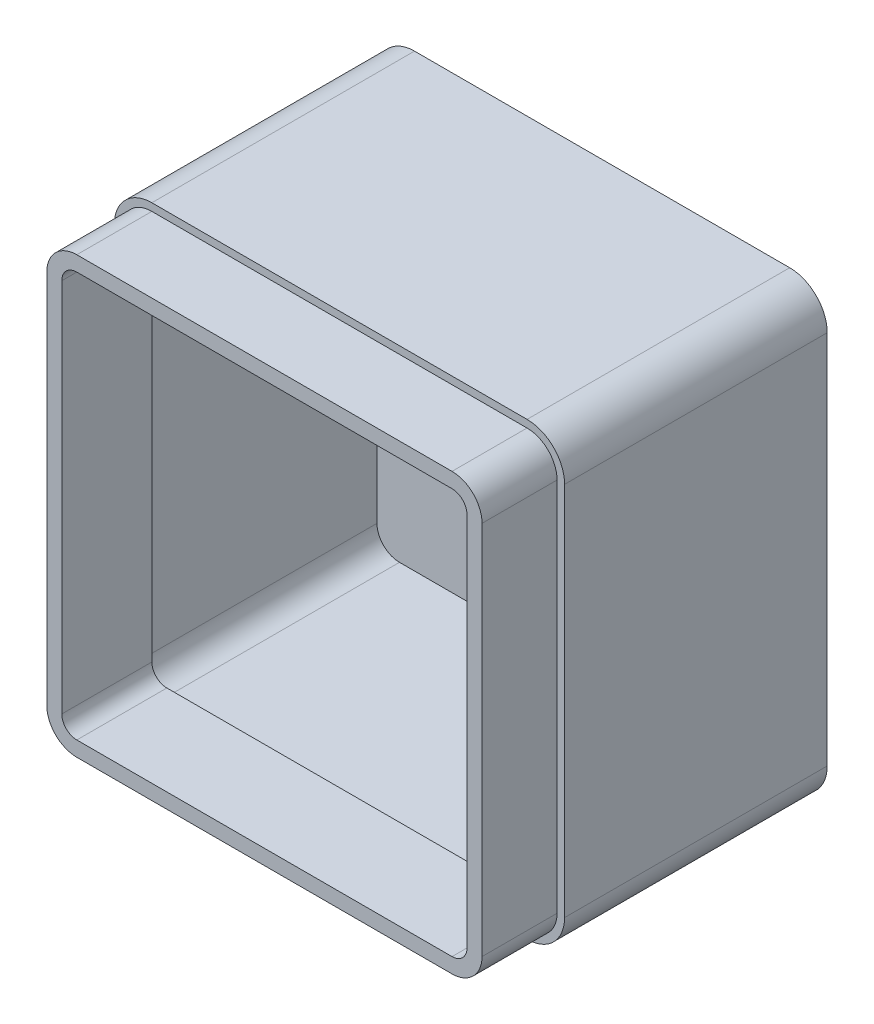
ISO-10303-21;
HEADER;
FILE_DESCRIPTION(('STEP AP214'),'2;1');
FILE_NAME('part.step','',(''),(''),'','','');
FILE_SCHEMA(('AUTOMOTIVE_DESIGN { 1 0 10303 214 1 1 1 1 }'));
ENDSEC;
DATA;
#1=APPLICATION_CONTEXT('core data for automotive mechanical design processes');
#2=APPLICATION_PROTOCOL_DEFINITION('international standard','automotive_design',2000,#1);
#3=PRODUCT_CONTEXT('',#1,'mechanical');
#4=PRODUCT('Part','Part','',(#3));
#5=PRODUCT_RELATED_PRODUCT_CATEGORY('part','',(#4));
#6=PRODUCT_DEFINITION_FORMATION('','',#4);
#7=PRODUCT_DEFINITION_CONTEXT('part definition',#1,'design');
#8=PRODUCT_DEFINITION('design','',#6,#7);
#9=PRODUCT_DEFINITION_SHAPE('','',#8);
#10=(LENGTH_UNIT() NAMED_UNIT(*) SI_UNIT(.MILLI.,.METRE.));
#11=(NAMED_UNIT(*) PLANE_ANGLE_UNIT() SI_UNIT($,.RADIAN.));
#12=(NAMED_UNIT(*) SI_UNIT($,.STERADIAN.) SOLID_ANGLE_UNIT());
#13=UNCERTAINTY_MEASURE_WITH_UNIT(LENGTH_MEASURE(1.E-05),#10,'distance_accuracy_value','');
#14=(GEOMETRIC_REPRESENTATION_CONTEXT(3) GLOBAL_UNCERTAINTY_ASSIGNED_CONTEXT((#13)) GLOBAL_UNIT_ASSIGNED_CONTEXT((#10,
#11,#12)) REPRESENTATION_CONTEXT('',''));
#15=CARTESIAN_POINT('',(0.,0.,0.));
#16=DIRECTION('',(0.,0.,1.));
#17=DIRECTION('',(1.,0.,0.));
#18=AXIS2_PLACEMENT_3D('',#15,#16,#17);
#19=CARTESIAN_POINT('',(60.,60.,90.));
#20=DIRECTION('',(-1.,0.,0.));
#21=DIRECTION('',(0.,-1.,0.));
#22=AXIS2_PLACEMENT_3D('',#19,#20,#21);
#23=PLANE('',#22);
#24=DIRECTION('',(0.,1.,0.));
#25=VECTOR('',#24,1.);
#26=CARTESIAN_POINT('',(60.,-50.,70.));
#27=LINE('',#26,#25);
#28=CARTESIAN_POINT('',(60.,-50.,70.));
#29=VERTEX_POINT('',#28);
#30=CARTESIAN_POINT('',(60.,50.,70.));
#31=VERTEX_POINT('',#30);
#32=EDGE_CURVE('E445',#29,#31,#27,.T.);
#33=ORIENTED_EDGE('',*,*,#32,.F.);
#34=DIRECTION('',(0.,0.,-1.));
#35=VECTOR('',#34,1.);
#36=CARTESIAN_POINT('',(60.,-50.,90.));
#37=LINE('',#36,#35);
#38=CARTESIAN_POINT('',(60.,-50.,0.));
#39=VERTEX_POINT('',#38);
#40=EDGE_CURVE('E39',#29,#39,#37,.T.);
#41=ORIENTED_EDGE('',*,*,#40,.T.);
#42=DIRECTION('',(0.,1.,0.));
#43=VECTOR('',#42,1.);
#44=CARTESIAN_POINT('',(60.,60.,0.));
#45=LINE('',#44,#43);
#46=CARTESIAN_POINT('',(60.,50.,0.));
#47=VERTEX_POINT('',#46);
#48=EDGE_CURVE('E451',#39,#47,#45,.T.);
#49=ORIENTED_EDGE('',*,*,#48,.T.);
#50=DIRECTION('',(0.,0.,-1.));
#51=VECTOR('',#50,1.);
#52=CARTESIAN_POINT('',(60.,50.,90.));
#53=LINE('',#52,#51);
#54=EDGE_CURVE('E11',#47,#31,#53,.F.);
#55=ORIENTED_EDGE('',*,*,#54,.T.);
#56=EDGE_LOOP('',(#33,#41,#49,#55));
#57=FACE_BOUND('',#56,.T.);
#58=ADVANCED_FACE('F31',(#57),#23,.F.);
#59=CARTESIAN_POINT('',(-60.,60.,90.));
#60=DIRECTION('',(0.,-1.,0.));
#61=DIRECTION('',(0.,0.,-1.));
#62=AXIS2_PLACEMENT_3D('',#59,#60,#61);
#63=PLANE('',#62);
#64=DIRECTION('',(-1.,0.,0.));
#65=VECTOR('',#64,1.);
#66=CARTESIAN_POINT('',(50.,60.,70.));
#67=LINE('',#66,#65);
#68=CARTESIAN_POINT('',(50.,60.,70.));
#69=VERTEX_POINT('',#68);
#70=CARTESIAN_POINT('',(-50.,60.,70.));
#71=VERTEX_POINT('',#70);
#72=EDGE_CURVE('E449',#69,#71,#67,.T.);
#73=ORIENTED_EDGE('',*,*,#72,.F.);
#74=DIRECTION('',(0.,0.,-1.));
#75=VECTOR('',#74,1.);
#76=CARTESIAN_POINT('',(50.,60.,90.));
#77=LINE('',#76,#75);
#78=CARTESIAN_POINT('',(50.,60.,0.));
#79=VERTEX_POINT('',#78);
#80=EDGE_CURVE('E481',#69,#79,#77,.T.);
#81=ORIENTED_EDGE('',*,*,#80,.T.);
#82=DIRECTION('',(-1.,0.,0.));
#83=VECTOR('',#82,1.);
#84=CARTESIAN_POINT('',(-60.,60.,0.));
#85=LINE('',#84,#83);
#86=CARTESIAN_POINT('',(-50.,60.,0.));
#87=VERTEX_POINT('',#86);
#88=EDGE_CURVE('E454',#79,#87,#85,.T.);
#89=ORIENTED_EDGE('',*,*,#88,.T.);
#90=DIRECTION('',(0.,0.,-1.));
#91=VECTOR('',#90,1.);
#92=CARTESIAN_POINT('',(-50.,60.,90.));
#93=LINE('',#92,#91);
#94=EDGE_CURVE('E483',#87,#71,#93,.F.);
#95=ORIENTED_EDGE('',*,*,#94,.T.);
#96=EDGE_LOOP('',(#73,#81,#89,#95));
#97=FACE_BOUND('',#96,.T.);
#98=ADVANCED_FACE('F508',(#97),#63,.F.);
#99=CARTESIAN_POINT('',(-60.,60.,90.));
#100=DIRECTION('',(1.,0.,0.));
#101=DIRECTION('',(0.,1.,0.));
#102=AXIS2_PLACEMENT_3D('',#99,#100,#101);
#103=PLANE('',#102);
#104=DIRECTION('',(0.,-1.,0.));
#105=VECTOR('',#104,1.);
#106=CARTESIAN_POINT('',(-60.,50.,70.));
#107=LINE('',#106,#105);
#108=CARTESIAN_POINT('',(-60.,50.,70.));
#109=VERTEX_POINT('',#108);
#110=CARTESIAN_POINT('',(-60.,-50.,70.));
#111=VERTEX_POINT('',#110);
#112=EDGE_CURVE('E437',#109,#111,#107,.T.);
#113=ORIENTED_EDGE('',*,*,#112,.F.);
#114=DIRECTION('',(0.,0.,-1.));
#115=VECTOR('',#114,1.);
#116=CARTESIAN_POINT('',(-60.,50.,90.));
#117=LINE('',#116,#115);
#118=CARTESIAN_POINT('',(-60.,50.,0.));
#119=VERTEX_POINT('',#118);
#120=EDGE_CURVE('E476',#109,#119,#117,.T.);
#121=ORIENTED_EDGE('',*,*,#120,.T.);
#122=DIRECTION('',(0.,-1.,0.));
#123=VECTOR('',#122,1.);
#124=CARTESIAN_POINT('',(-60.,60.,0.));
#125=LINE('',#124,#123);
#126=CARTESIAN_POINT('',(-60.,-50.,0.));
#127=VERTEX_POINT('',#126);
#128=EDGE_CURVE('E457',#119,#127,#125,.T.);
#129=ORIENTED_EDGE('',*,*,#128,.T.);
#130=DIRECTION('',(0.,0.,-1.));
#131=VECTOR('',#130,1.);
#132=CARTESIAN_POINT('',(-60.,-50.,90.));
#133=LINE('',#132,#131);
#134=EDGE_CURVE('E478',#127,#111,#133,.F.);
#135=ORIENTED_EDGE('',*,*,#134,.T.);
#136=EDGE_LOOP('',(#113,#121,#129,#135));
#137=FACE_BOUND('',#136,.T.);
#138=ADVANCED_FACE('F518',(#137),#103,.F.);
#139=CARTESIAN_POINT('',(-60.,-60.,90.));
#140=DIRECTION('',(0.,1.,0.));
#141=DIRECTION('',(0.,0.,1.));
#142=AXIS2_PLACEMENT_3D('',#139,#140,#141);
#143=PLANE('',#142);
#144=DIRECTION('',(1.,0.,0.));
#145=VECTOR('',#144,1.);
#146=CARTESIAN_POINT('',(-50.,-60.,70.));
#147=LINE('',#146,#145);
#148=CARTESIAN_POINT('',(-50.,-60.,70.));
#149=VERTEX_POINT('',#148);
#150=CARTESIAN_POINT('',(50.,-60.,70.));
#151=VERTEX_POINT('',#150);
#152=EDGE_CURVE('E441',#149,#151,#147,.T.);
#153=ORIENTED_EDGE('',*,*,#152,.F.);
#154=DIRECTION('',(0.,0.,-1.));
#155=VECTOR('',#154,1.);
#156=CARTESIAN_POINT('',(-50.,-60.,90.));
#157=LINE('',#156,#155);
#158=CARTESIAN_POINT('',(-50.,-60.,0.));
#159=VERTEX_POINT('',#158);
#160=EDGE_CURVE('E466',#149,#159,#157,.T.);
#161=ORIENTED_EDGE('',*,*,#160,.T.);
#162=DIRECTION('',(1.,0.,0.));
#163=VECTOR('',#162,1.);
#164=CARTESIAN_POINT('',(-60.,-60.,0.));
#165=LINE('',#164,#163);
#166=CARTESIAN_POINT('',(50.,-60.,0.));
#167=VERTEX_POINT('',#166);
#168=EDGE_CURVE('E460',#159,#167,#165,.T.);
#169=ORIENTED_EDGE('',*,*,#168,.T.);
#170=DIRECTION('',(0.,0.,-1.));
#171=VECTOR('',#170,1.);
#172=CARTESIAN_POINT('',(50.,-60.,90.));
#173=LINE('',#172,#171);
#174=EDGE_CURVE('E463',#167,#151,#173,.F.);
#175=ORIENTED_EDGE('',*,*,#174,.T.);
#176=EDGE_LOOP('',(#153,#161,#169,#175));
#177=FACE_BOUND('',#176,.T.);
#178=ADVANCED_FACE('F526',(#177),#143,.F.);
#179=CARTESIAN_POINT('',(-50.,-50.,90.));
#180=DIRECTION('',(0.,0.,-1.));
#181=DIRECTION('',(-1.,0.,0.));
#182=AXIS2_PLACEMENT_3D('',#179,#180,#181);
#183=CYLINDRICAL_SURFACE('',#182,10.);
#184=ORIENTED_EDGE('',*,*,#160,.F.);
#185=CARTESIAN_POINT('',(-50.,-50.,70.));
#186=DIRECTION('',(0.,0.,1.));
#187=DIRECTION('',(1.,0.,0.));
#188=AXIS2_PLACEMENT_3D('',#185,#186,#187);
#189=CIRCLE('',#188,9.99999999999999);
#190=EDGE_CURVE('E439',#111,#149,#189,.T.);
#191=ORIENTED_EDGE('',*,*,#190,.F.);
#192=ORIENTED_EDGE('',*,*,#134,.F.);
#193=CARTESIAN_POINT('',(-50.,-50.,0.));
#194=DIRECTION('',(0.,0.,1.));
#195=DIRECTION('',(1.,0.,0.));
#196=AXIS2_PLACEMENT_3D('',#193,#194,#195);
#197=CIRCLE('',#196,10.);
#198=EDGE_CURVE('E474',#159,#127,#197,.F.);
#199=ORIENTED_EDGE('',*,*,#198,.F.);
#200=EDGE_LOOP('',(#184,#191,#192,#199));
#201=FACE_BOUND('',#200,.T.);
#202=ADVANCED_FACE('F523',(#201),#183,.T.);
#203=CARTESIAN_POINT('',(-50.,50.,90.));
#204=DIRECTION('',(0.,0.,-1.));
#205=DIRECTION('',(-1.,0.,0.));
#206=AXIS2_PLACEMENT_3D('',#203,#204,#205);
#207=CYLINDRICAL_SURFACE('',#206,10.);
#208=ORIENTED_EDGE('',*,*,#120,.F.);
#209=CARTESIAN_POINT('',(-50.,50.,70.));
#210=DIRECTION('',(0.,0.,1.));
#211=DIRECTION('',(1.,0.,0.));
#212=AXIS2_PLACEMENT_3D('',#209,#210,#211);
#213=CIRCLE('',#212,10.);
#214=EDGE_CURVE('E422',#71,#109,#213,.T.);
#215=ORIENTED_EDGE('',*,*,#214,.F.);
#216=ORIENTED_EDGE('',*,*,#94,.F.);
#217=CARTESIAN_POINT('',(-50.,50.,0.));
#218=DIRECTION('',(0.,0.,1.));
#219=DIRECTION('',(1.,0.,0.));
#220=AXIS2_PLACEMENT_3D('',#217,#218,#219);
#221=CIRCLE('',#220,10.);
#222=EDGE_CURVE('E472',#119,#87,#221,.F.);
#223=ORIENTED_EDGE('',*,*,#222,.F.);
#224=EDGE_LOOP('',(#208,#215,#216,#223));
#225=FACE_BOUND('',#224,.T.);
#226=ADVANCED_FACE('F513',(#225),#207,.T.);
#227=CARTESIAN_POINT('',(50.,50.,90.));
#228=DIRECTION('',(0.,0.,-1.));
#229=DIRECTION('',(-1.,0.,0.));
#230=AXIS2_PLACEMENT_3D('',#227,#228,#229);
#231=CYLINDRICAL_SURFACE('',#230,10.);
#232=ORIENTED_EDGE('',*,*,#80,.F.);
#233=CARTESIAN_POINT('',(50.,50.,70.));
#234=DIRECTION('',(0.,0.,1.));
#235=DIRECTION('',(1.,0.,0.));
#236=AXIS2_PLACEMENT_3D('',#233,#234,#235);
#237=CIRCLE('',#236,9.99999999999999);
#238=EDGE_CURVE('E447',#31,#69,#237,.T.);
#239=ORIENTED_EDGE('',*,*,#238,.F.);
#240=ORIENTED_EDGE('',*,*,#54,.F.);
#241=CARTESIAN_POINT('',(50.,50.,0.));
#242=DIRECTION('',(0.,0.,1.));
#243=DIRECTION('',(1.,0.,0.));
#244=AXIS2_PLACEMENT_3D('',#241,#242,#243);
#245=CIRCLE('',#244,10.);
#246=EDGE_CURVE('E470',#79,#47,#245,.F.);
#247=ORIENTED_EDGE('',*,*,#246,.F.);
#248=EDGE_LOOP('',(#232,#239,#240,#247));
#249=FACE_BOUND('',#248,.T.);
#250=ADVANCED_FACE('F501',(#249),#231,.T.);
#251=CARTESIAN_POINT('',(50.,-50.,90.));
#252=DIRECTION('',(0.,0.,-1.));
#253=DIRECTION('',(-1.,0.,0.));
#254=AXIS2_PLACEMENT_3D('',#251,#252,#253);
#255=CYLINDRICAL_SURFACE('',#254,10.);
#256=ORIENTED_EDGE('',*,*,#40,.F.);
#257=CARTESIAN_POINT('',(50.,-50.,70.));
#258=DIRECTION('',(0.,0.,1.));
#259=DIRECTION('',(1.,0.,0.));
#260=AXIS2_PLACEMENT_3D('',#257,#258,#259);
#261=CIRCLE('',#260,10.);
#262=EDGE_CURVE('E443',#151,#29,#261,.T.);
#263=ORIENTED_EDGE('',*,*,#262,.F.);
#264=ORIENTED_EDGE('',*,*,#174,.F.);
#265=CARTESIAN_POINT('',(50.,-50.,0.));
#266=DIRECTION('',(0.,0.,1.));
#267=DIRECTION('',(1.,0.,0.));
#268=AXIS2_PLACEMENT_3D('',#265,#266,#267);
#269=CIRCLE('',#268,10.);
#270=EDGE_CURVE('E468',#39,#167,#269,.F.);
#271=ORIENTED_EDGE('',*,*,#270,.F.);
#272=EDGE_LOOP('',(#256,#263,#264,#271));
#273=FACE_BOUND('',#272,.T.);
#274=ADVANCED_FACE('F33',(#273),#255,.T.);
#275=CARTESIAN_POINT('',(60.,-60.,0.));
#276=DIRECTION('',(0.,0.,1.));
#277=DIRECTION('',(1.,0.,0.));
#278=AXIS2_PLACEMENT_3D('',#275,#276,#277);
#279=PLANE('',#278);
#280=ORIENTED_EDGE('',*,*,#168,.F.);
#281=ORIENTED_EDGE('',*,*,#198,.T.);
#282=ORIENTED_EDGE('',*,*,#128,.F.);
#283=ORIENTED_EDGE('',*,*,#222,.T.);
#284=ORIENTED_EDGE('',*,*,#88,.F.);
#285=ORIENTED_EDGE('',*,*,#246,.T.);
#286=ORIENTED_EDGE('',*,*,#48,.F.);
#287=ORIENTED_EDGE('',*,*,#270,.T.);
#288=EDGE_LOOP('',(#280,#281,#282,#283,#284,#285,#286,#287));
#289=FACE_BOUND('',#288,.T.);
#290=ADVANCED_FACE('F496',(#289),#279,.F.);
#291=CARTESIAN_POINT('',(-50.,50.,70.));
#292=DIRECTION('',(0.,0.,1.));
#293=DIRECTION('',(1.,0.,0.));
#294=AXIS2_PLACEMENT_3D('',#291,#292,#293);
#295=PLANE('',#294);
#296=DIRECTION('',(-1.,0.,0.));
#297=VECTOR('',#296,1.);
#298=CARTESIAN_POINT('',(50.,58.,70.));
#299=LINE('',#298,#297);
#300=CARTESIAN_POINT('',(50.,58.,70.));
#301=VERTEX_POINT('',#300);
#302=CARTESIAN_POINT('',(-50.,58.,70.));
#303=VERTEX_POINT('',#302);
#304=EDGE_CURVE('E399',#301,#303,#299,.T.);
#305=ORIENTED_EDGE('',*,*,#304,.F.);
#306=CARTESIAN_POINT('',(50.,50.,70.));
#307=DIRECTION('',(0.,0.,1.));
#308=DIRECTION('',(1.,0.,0.));
#309=AXIS2_PLACEMENT_3D('',#306,#307,#308);
#310=CIRCLE('',#309,8.);
#311=CARTESIAN_POINT('',(58.,50.,70.));
#312=VERTEX_POINT('',#311);
#313=EDGE_CURVE('E396',#312,#301,#310,.T.);
#314=ORIENTED_EDGE('',*,*,#313,.F.);
#315=DIRECTION('',(0.,1.,0.));
#316=VECTOR('',#315,1.);
#317=CARTESIAN_POINT('',(58.,-50.,70.));
#318=LINE('',#317,#316);
#319=CARTESIAN_POINT('',(58.,-50.,70.));
#320=VERTEX_POINT('',#319);
#321=EDGE_CURVE('E393',#320,#312,#318,.T.);
#322=ORIENTED_EDGE('',*,*,#321,.F.);
#323=CARTESIAN_POINT('',(50.,-50.,70.));
#324=DIRECTION('',(0.,0.,1.));
#325=DIRECTION('',(1.,0.,0.));
#326=AXIS2_PLACEMENT_3D('',#323,#324,#325);
#327=CIRCLE('',#326,8.);
#328=CARTESIAN_POINT('',(50.,-58.,70.));
#329=VERTEX_POINT('',#328);
#330=EDGE_CURVE('E390',#329,#320,#327,.T.);
#331=ORIENTED_EDGE('',*,*,#330,.F.);
#332=DIRECTION('',(1.,0.,0.));
#333=VECTOR('',#332,1.);
#334=CARTESIAN_POINT('',(-50.,-58.,70.));
#335=LINE('',#334,#333);
#336=CARTESIAN_POINT('',(-50.,-58.,70.));
#337=VERTEX_POINT('',#336);
#338=EDGE_CURVE('E387',#337,#329,#335,.T.);
#339=ORIENTED_EDGE('',*,*,#338,.F.);
#340=CARTESIAN_POINT('',(-50.,-50.,70.));
#341=DIRECTION('',(0.,0.,1.));
#342=DIRECTION('',(1.,0.,0.));
#343=AXIS2_PLACEMENT_3D('',#340,#341,#342);
#344=CIRCLE('',#343,8.);
#345=CARTESIAN_POINT('',(-58.,-50.,70.));
#346=VERTEX_POINT('',#345);
#347=EDGE_CURVE('E384',#346,#337,#344,.T.);
#348=ORIENTED_EDGE('',*,*,#347,.F.);
#349=DIRECTION('',(0.,-1.,0.));
#350=VECTOR('',#349,1.);
#351=CARTESIAN_POINT('',(-58.,50.,70.));
#352=LINE('',#351,#350);
#353=CARTESIAN_POINT('',(-58.,50.,70.));
#354=VERTEX_POINT('',#353);
#355=EDGE_CURVE('E380',#354,#346,#352,.T.);
#356=ORIENTED_EDGE('',*,*,#355,.F.);
#357=CARTESIAN_POINT('',(-50.,50.,70.));
#358=DIRECTION('',(0.,0.,1.));
#359=DIRECTION('',(1.,0.,0.));
#360=AXIS2_PLACEMENT_3D('',#357,#358,#359);
#361=CIRCLE('',#360,8.);
#362=EDGE_CURVE('E377',#303,#354,#361,.T.);
#363=ORIENTED_EDGE('',*,*,#362,.F.);
#364=EDGE_LOOP('',(#305,#314,#322,#331,#339,#348,#356,#363));
#365=FACE_BOUND('',#364,.T.);
#366=ORIENTED_EDGE('',*,*,#214,.T.);
#367=ORIENTED_EDGE('',*,*,#112,.T.);
#368=ORIENTED_EDGE('',*,*,#190,.T.);
#369=ORIENTED_EDGE('',*,*,#152,.T.);
#370=ORIENTED_EDGE('',*,*,#262,.T.);
#371=ORIENTED_EDGE('',*,*,#32,.T.);
#372=ORIENTED_EDGE('',*,*,#238,.T.);
#373=ORIENTED_EDGE('',*,*,#72,.T.);
#374=EDGE_LOOP('',(#366,#367,#368,#369,#370,#371,#372,#373));
#375=FACE_BOUND('',#374,.T.);
#376=ADVANCED_FACE('F505',(#365,#375),#295,.T.);
#377=CARTESIAN_POINT('',(-50.,50.,70.));
#378=DIRECTION('',(0.,0.,1.));
#379=DIRECTION('',(1.,0.,0.));
#380=AXIS2_PLACEMENT_3D('',#377,#378,#379);
#381=CYLINDRICAL_SURFACE('',#380,8.);
#382=CARTESIAN_POINT('',(-50.,50.,90.));
#383=DIRECTION('',(0.,0.,1.));
#384=DIRECTION('',(1.,0.,0.));
#385=AXIS2_PLACEMENT_3D('',#382,#383,#384);
#386=CIRCLE('',#385,8.);
#387=CARTESIAN_POINT('',(-50.,58.,90.));
#388=VERTEX_POINT('',#387);
#389=CARTESIAN_POINT('',(-58.,50.,90.));
#390=VERTEX_POINT('',#389);
#391=EDGE_CURVE('E265',#388,#390,#386,.T.);
#392=ORIENTED_EDGE('',*,*,#391,.F.);
#393=DIRECTION('',(0.,0.,1.));
#394=VECTOR('',#393,1.);
#395=CARTESIAN_POINT('',(-50.,58.,70.));
#396=LINE('',#395,#394);
#397=EDGE_CURVE('E420',#303,#388,#396,.T.);
#398=ORIENTED_EDGE('',*,*,#397,.F.);
#399=ORIENTED_EDGE('',*,*,#362,.T.);
#400=DIRECTION('',(0.,0.,1.));
#401=VECTOR('',#400,1.);
#402=CARTESIAN_POINT('',(-58.,50.,70.));
#403=LINE('',#402,#401);
#404=EDGE_CURVE('E401',#354,#390,#403,.T.);
#405=ORIENTED_EDGE('',*,*,#404,.T.);
#406=EDGE_LOOP('',(#392,#398,#399,#405));
#407=FACE_BOUND('',#406,.T.);
#408=ADVANCED_FACE('F554',(#407),#381,.T.);
#409=CARTESIAN_POINT('',(50.,58.,70.));
#410=DIRECTION('',(0.,1.,0.));
#411=DIRECTION('',(0.,0.,1.));
#412=AXIS2_PLACEMENT_3D('',#409,#410,#411);
#413=PLANE('',#412);
#414=DIRECTION('',(-1.,0.,0.));
#415=VECTOR('',#414,1.);
#416=CARTESIAN_POINT('',(50.,58.,90.));
#417=LINE('',#416,#415);
#418=CARTESIAN_POINT('',(50.,58.,90.));
#419=VERTEX_POINT('',#418);
#420=EDGE_CURVE('E381',#419,#388,#417,.T.);
#421=ORIENTED_EDGE('',*,*,#420,.F.);
#422=DIRECTION('',(0.,0.,1.));
#423=VECTOR('',#422,1.);
#424=CARTESIAN_POINT('',(50.,58.,70.));
#425=LINE('',#424,#423);
#426=EDGE_CURVE('E423',#301,#419,#425,.T.);
#427=ORIENTED_EDGE('',*,*,#426,.F.);
#428=ORIENTED_EDGE('',*,*,#304,.T.);
#429=ORIENTED_EDGE('',*,*,#397,.T.);
#430=EDGE_LOOP('',(#421,#427,#428,#429));
#431=FACE_BOUND('',#430,.T.);
#432=ADVANCED_FACE('F565',(#431),#413,.T.);
#433=CARTESIAN_POINT('',(50.,50.,70.));
#434=DIRECTION('',(0.,0.,1.));
#435=DIRECTION('',(1.,0.,0.));
#436=AXIS2_PLACEMENT_3D('',#433,#434,#435);
#437=CYLINDRICAL_SURFACE('',#436,8.);
#438=CARTESIAN_POINT('',(50.,50.,90.));
#439=DIRECTION('',(0.,0.,1.));
#440=DIRECTION('',(1.,0.,0.));
#441=AXIS2_PLACEMENT_3D('',#438,#439,#440);
#442=CIRCLE('',#441,8.);
#443=CARTESIAN_POINT('',(58.,50.,90.));
#444=VERTEX_POINT('',#443);
#445=EDGE_CURVE('E415',#444,#419,#442,.T.);
#446=ORIENTED_EDGE('',*,*,#445,.F.);
#447=DIRECTION('',(0.,0.,1.));
#448=VECTOR('',#447,1.);
#449=CARTESIAN_POINT('',(58.,50.,70.));
#450=LINE('',#449,#448);
#451=EDGE_CURVE('E425',#312,#444,#450,.T.);
#452=ORIENTED_EDGE('',*,*,#451,.F.);
#453=ORIENTED_EDGE('',*,*,#313,.T.);
#454=ORIENTED_EDGE('',*,*,#426,.T.);
#455=EDGE_LOOP('',(#446,#452,#453,#454));
#456=FACE_BOUND('',#455,.T.);
#457=ADVANCED_FACE('F584',(#456),#437,.T.);
#458=CARTESIAN_POINT('',(58.,-50.,70.));
#459=DIRECTION('',(1.,0.,0.));
#460=DIRECTION('',(0.,1.,0.));
#461=AXIS2_PLACEMENT_3D('',#458,#459,#460);
#462=PLANE('',#461);
#463=DIRECTION('',(0.,1.,0.));
#464=VECTOR('',#463,1.);
#465=CARTESIAN_POINT('',(58.,-50.,90.));
#466=LINE('',#465,#464);
#467=CARTESIAN_POINT('',(58.,-50.,90.));
#468=VERTEX_POINT('',#467);
#469=EDGE_CURVE('E412',#468,#444,#466,.T.);
#470=ORIENTED_EDGE('',*,*,#469,.F.);
#471=DIRECTION('',(0.,0.,1.));
#472=VECTOR('',#471,1.);
#473=CARTESIAN_POINT('',(58.,-50.,70.));
#474=LINE('',#473,#472);
#475=EDGE_CURVE('E427',#320,#468,#474,.T.);
#476=ORIENTED_EDGE('',*,*,#475,.F.);
#477=ORIENTED_EDGE('',*,*,#321,.T.);
#478=ORIENTED_EDGE('',*,*,#451,.T.);
#479=EDGE_LOOP('',(#470,#476,#477,#478));
#480=FACE_BOUND('',#479,.T.);
#481=ADVANCED_FACE('F580',(#480),#462,.T.);
#482=CARTESIAN_POINT('',(50.,-50.,70.));
#483=DIRECTION('',(0.,0.,1.));
#484=DIRECTION('',(1.,0.,0.));
#485=AXIS2_PLACEMENT_3D('',#482,#483,#484);
#486=CYLINDRICAL_SURFACE('',#485,8.);
#487=CARTESIAN_POINT('',(50.,-50.,90.));
#488=DIRECTION('',(0.,0.,1.));
#489=DIRECTION('',(1.,0.,0.));
#490=AXIS2_PLACEMENT_3D('',#487,#488,#489);
#491=CIRCLE('',#490,8.);
#492=CARTESIAN_POINT('',(50.,-58.,90.));
#493=VERTEX_POINT('',#492);
#494=EDGE_CURVE('E409',#493,#468,#491,.T.);
#495=ORIENTED_EDGE('',*,*,#494,.F.);
#496=DIRECTION('',(0.,0.,1.));
#497=VECTOR('',#496,1.);
#498=CARTESIAN_POINT('',(50.,-58.,70.));
#499=LINE('',#498,#497);
#500=EDGE_CURVE('E429',#329,#493,#499,.T.);
#501=ORIENTED_EDGE('',*,*,#500,.F.);
#502=ORIENTED_EDGE('',*,*,#330,.T.);
#503=ORIENTED_EDGE('',*,*,#475,.T.);
#504=EDGE_LOOP('',(#495,#501,#502,#503));
#505=FACE_BOUND('',#504,.T.);
#506=ADVANCED_FACE('F576',(#505),#486,.T.);
#507=CARTESIAN_POINT('',(-50.,-58.,70.));
#508=DIRECTION('',(0.,-1.,0.));
#509=DIRECTION('',(0.,0.,-1.));
#510=AXIS2_PLACEMENT_3D('',#507,#508,#509);
#511=PLANE('',#510);
#512=DIRECTION('',(1.,0.,0.));
#513=VECTOR('',#512,1.);
#514=CARTESIAN_POINT('',(-50.,-58.,90.));
#515=LINE('',#514,#513);
#516=CARTESIAN_POINT('',(-50.,-58.,90.));
#517=VERTEX_POINT('',#516);
#518=EDGE_CURVE('E406',#517,#493,#515,.T.);
#519=ORIENTED_EDGE('',*,*,#518,.F.);
#520=DIRECTION('',(0.,0.,1.));
#521=VECTOR('',#520,1.);
#522=CARTESIAN_POINT('',(-50.,-58.,70.));
#523=LINE('',#522,#521);
#524=EDGE_CURVE('E431',#337,#517,#523,.T.);
#525=ORIENTED_EDGE('',*,*,#524,.F.);
#526=ORIENTED_EDGE('',*,*,#338,.T.);
#527=ORIENTED_EDGE('',*,*,#500,.T.);
#528=EDGE_LOOP('',(#519,#525,#526,#527));
#529=FACE_BOUND('',#528,.T.);
#530=ADVANCED_FACE('F573',(#529),#511,.T.);
#531=CARTESIAN_POINT('',(-50.,-50.,70.));
#532=DIRECTION('',(0.,0.,1.));
#533=DIRECTION('',(1.,0.,0.));
#534=AXIS2_PLACEMENT_3D('',#531,#532,#533);
#535=CYLINDRICAL_SURFACE('',#534,8.);
#536=CARTESIAN_POINT('',(-50.,-50.,90.));
#537=DIRECTION('',(0.,0.,1.));
#538=DIRECTION('',(1.,0.,0.));
#539=AXIS2_PLACEMENT_3D('',#536,#537,#538);
#540=CIRCLE('',#539,8.);
#541=CARTESIAN_POINT('',(-58.,-50.,90.));
#542=VERTEX_POINT('',#541);
#543=EDGE_CURVE('E54',#542,#517,#540,.T.);
#544=ORIENTED_EDGE('',*,*,#543,.F.);
#545=DIRECTION('',(0.,0.,1.));
#546=VECTOR('',#545,1.);
#547=CARTESIAN_POINT('',(-58.,-50.,70.));
#548=LINE('',#547,#546);
#549=EDGE_CURVE('E433',#346,#542,#548,.T.);
#550=ORIENTED_EDGE('',*,*,#549,.F.);
#551=ORIENTED_EDGE('',*,*,#347,.T.);
#552=ORIENTED_EDGE('',*,*,#524,.T.);
#553=EDGE_LOOP('',(#544,#550,#551,#552));
#554=FACE_BOUND('',#553,.T.);
#555=ADVANCED_FACE('F569',(#554),#535,.T.);
#556=CARTESIAN_POINT('',(-58.,50.,70.));
#557=DIRECTION('',(-1.,0.,0.));
#558=DIRECTION('',(0.,-1.,0.));
#559=AXIS2_PLACEMENT_3D('',#556,#557,#558);
#560=PLANE('',#559);
#561=DIRECTION('',(0.,-1.,0.));
#562=VECTOR('',#561,1.);
#563=CARTESIAN_POINT('',(-58.,50.,90.));
#564=LINE('',#563,#562);
#565=EDGE_CURVE('E268',#390,#542,#564,.T.);
#566=ORIENTED_EDGE('',*,*,#565,.F.);
#567=ORIENTED_EDGE('',*,*,#404,.F.);
#568=ORIENTED_EDGE('',*,*,#355,.T.);
#569=ORIENTED_EDGE('',*,*,#549,.T.);
#570=EDGE_LOOP('',(#566,#567,#568,#569));
#571=FACE_BOUND('',#570,.T.);
#572=ADVANCED_FACE('F560',(#571),#560,.T.);
#573=CARTESIAN_POINT('',(60.,-60.,90.));
#574=DIRECTION('',(0.,0.,1.));
#575=DIRECTION('',(1.,0.,0.));
#576=AXIS2_PLACEMENT_3D('',#573,#574,#575);
#577=PLANE('',#576);
#578=DIRECTION('',(-1.,0.,0.));
#579=VECTOR('',#578,1.);
#580=CARTESIAN_POINT('',(60.,54.,90.));
#581=LINE('',#580,#579);
#582=CARTESIAN_POINT('',(50.,54.,90.));
#583=VERTEX_POINT('',#582);
#584=CARTESIAN_POINT('',(-50.,54.,90.));
#585=VERTEX_POINT('',#584);
#586=EDGE_CURVE('E341',#583,#585,#581,.T.);
#587=ORIENTED_EDGE('',*,*,#586,.F.);
#588=CARTESIAN_POINT('',(50.,50.,90.));
#589=DIRECTION('',(0.,0.,1.));
#590=DIRECTION('',(1.,0.,0.));
#591=AXIS2_PLACEMENT_3D('',#588,#589,#590);
#592=CIRCLE('',#591,4.);
#593=CARTESIAN_POINT('',(54.,50.,90.));
#594=VERTEX_POINT('',#593);
#595=EDGE_CURVE('E372',#594,#583,#592,.T.);
#596=ORIENTED_EDGE('',*,*,#595,.F.);
#597=DIRECTION('',(0.,1.,0.));
#598=VECTOR('',#597,1.);
#599=CARTESIAN_POINT('',(54.,-60.,90.));
#600=LINE('',#599,#598);
#601=CARTESIAN_POINT('',(54.,-50.,90.));
#602=VERTEX_POINT('',#601);
#603=EDGE_CURVE('E46',#602,#594,#600,.T.);
#604=ORIENTED_EDGE('',*,*,#603,.F.);
#605=CARTESIAN_POINT('',(50.,-50.,90.));
#606=DIRECTION('',(0.,0.,1.));
#607=DIRECTION('',(1.,0.,0.));
#608=AXIS2_PLACEMENT_3D('',#605,#606,#607);
#609=CIRCLE('',#608,4.);
#610=CARTESIAN_POINT('',(50.,-54.,90.));
#611=VERTEX_POINT('',#610);
#612=EDGE_CURVE('E368',#611,#602,#609,.T.);
#613=ORIENTED_EDGE('',*,*,#612,.F.);
#614=DIRECTION('',(1.,0.,0.));
#615=VECTOR('',#614,1.);
#616=CARTESIAN_POINT('',(60.,-54.,90.));
#617=LINE('',#616,#615);
#618=CARTESIAN_POINT('',(-50.,-54.,90.));
#619=VERTEX_POINT('',#618);
#620=EDGE_CURVE('E365',#619,#611,#617,.T.);
#621=ORIENTED_EDGE('',*,*,#620,.F.);
#622=CARTESIAN_POINT('',(-50.,-50.,90.));
#623=DIRECTION('',(0.,0.,1.));
#624=DIRECTION('',(1.,0.,0.));
#625=AXIS2_PLACEMENT_3D('',#622,#623,#624);
#626=CIRCLE('',#625,4.);
#627=CARTESIAN_POINT('',(-54.,-50.,90.));
#628=VERTEX_POINT('',#627);
#629=EDGE_CURVE('E362',#628,#619,#626,.T.);
#630=ORIENTED_EDGE('',*,*,#629,.F.);
#631=DIRECTION('',(0.,-1.,0.));
#632=VECTOR('',#631,1.);
#633=CARTESIAN_POINT('',(-54.,-60.,90.));
#634=LINE('',#633,#632);
#635=CARTESIAN_POINT('',(-54.,50.,90.));
#636=VERTEX_POINT('',#635);
#637=EDGE_CURVE('E359',#636,#628,#634,.T.);
#638=ORIENTED_EDGE('',*,*,#637,.F.);
#639=CARTESIAN_POINT('',(-50.,50.,90.));
#640=DIRECTION('',(0.,0.,1.));
#641=DIRECTION('',(1.,0.,0.));
#642=AXIS2_PLACEMENT_3D('',#639,#640,#641);
#643=CIRCLE('',#642,4.);
#644=EDGE_CURVE('E356',#585,#636,#643,.T.);
#645=ORIENTED_EDGE('',*,*,#644,.F.);
#646=EDGE_LOOP('',(#587,#596,#604,#613,#621,#630,#638,#645));
#647=FACE_BOUND('',#646,.T.);
#648=ORIENTED_EDGE('',*,*,#420,.T.);
#649=ORIENTED_EDGE('',*,*,#391,.T.);
#650=ORIENTED_EDGE('',*,*,#565,.T.);
#651=ORIENTED_EDGE('',*,*,#543,.T.);
#652=ORIENTED_EDGE('',*,*,#518,.T.);
#653=ORIENTED_EDGE('',*,*,#494,.T.);
#654=ORIENTED_EDGE('',*,*,#469,.T.);
#655=ORIENTED_EDGE('',*,*,#445,.T.);
#656=EDGE_LOOP('',(#648,#649,#650,#651,#652,#653,#654,#655));
#657=FACE_BOUND('',#656,.T.);
#658=ADVANCED_FACE('F558',(#647,#657),#577,.T.);
#659=CARTESIAN_POINT('',(56.,60.,90.));
#660=DIRECTION('',(-1.,0.,0.));
#661=DIRECTION('',(0.,-1.,0.));
#662=AXIS2_PLACEMENT_3D('',#659,#660,#661);
#663=PLANE('',#662);
#664=DIRECTION('',(0.,1.,0.));
#665=VECTOR('',#664,1.);
#666=CARTESIAN_POINT('',(56.,60.,66.));
#667=LINE('',#666,#665);
#668=CARTESIAN_POINT('',(56.,-50.,66.));
#669=VERTEX_POINT('',#668);
#670=CARTESIAN_POINT('',(56.,50.,66.));
#671=VERTEX_POINT('',#670);
#672=EDGE_CURVE('E242',#669,#671,#667,.T.);
#673=ORIENTED_EDGE('',*,*,#672,.T.);
#674=DIRECTION('',(0.,0.,1.));
#675=VECTOR('',#674,1.);
#676=CARTESIAN_POINT('',(56.,50.,90.));
#677=LINE('',#676,#675);
#678=CARTESIAN_POINT('',(56.,50.,4.));
#679=VERTEX_POINT('',#678);
#680=EDGE_CURVE('E247',#679,#671,#677,.T.);
#681=ORIENTED_EDGE('',*,*,#680,.F.);
#682=DIRECTION('',(0.,1.,0.));
#683=VECTOR('',#682,1.);
#684=CARTESIAN_POINT('',(56.,60.,4.));
#685=LINE('',#684,#683);
#686=CARTESIAN_POINT('',(56.,-50.,4.));
#687=VERTEX_POINT('',#686);
#688=EDGE_CURVE('E274',#687,#679,#685,.T.);
#689=ORIENTED_EDGE('',*,*,#688,.F.);
#690=DIRECTION('',(0.,0.,1.));
#691=VECTOR('',#690,1.);
#692=CARTESIAN_POINT('',(56.,-50.,90.));
#693=LINE('',#692,#691);
#694=EDGE_CURVE('E248',#669,#687,#693,.F.);
#695=ORIENTED_EDGE('',*,*,#694,.F.);
#696=EDGE_LOOP('',(#673,#681,#689,#695));
#697=FACE_BOUND('',#696,.T.);
#698=ADVANCED_FACE('F244',(#697),#663,.T.);
#699=CARTESIAN_POINT('',(-60.,56.,90.));
#700=DIRECTION('',(0.,-1.,0.));
#701=DIRECTION('',(0.,0.,-1.));
#702=AXIS2_PLACEMENT_3D('',#699,#700,#701);
#703=PLANE('',#702);
#704=DIRECTION('',(-1.,0.,0.));
#705=VECTOR('',#704,1.);
#706=CARTESIAN_POINT('',(-60.,56.,66.));
#707=LINE('',#706,#705);
#708=CARTESIAN_POINT('',(50.,56.,66.));
#709=VERTEX_POINT('',#708);
#710=CARTESIAN_POINT('',(-50.,56.,66.));
#711=VERTEX_POINT('',#710);
#712=EDGE_CURVE('E257',#709,#711,#707,.T.);
#713=ORIENTED_EDGE('',*,*,#712,.T.);
#714=DIRECTION('',(0.,0.,-1.));
#715=VECTOR('',#714,1.);
#716=CARTESIAN_POINT('',(-50.,56.,90.));
#717=LINE('',#716,#715);
#718=CARTESIAN_POINT('',(-50.,56.,4.));
#719=VERTEX_POINT('',#718);
#720=EDGE_CURVE('E270',#719,#711,#717,.F.);
#721=ORIENTED_EDGE('',*,*,#720,.F.);
#722=DIRECTION('',(-1.,0.,0.));
#723=VECTOR('',#722,1.);
#724=CARTESIAN_POINT('',(-60.,56.,4.));
#725=LINE('',#724,#723);
#726=CARTESIAN_POINT('',(50.,56.,4.));
#727=VERTEX_POINT('',#726);
#728=EDGE_CURVE('E282',#727,#719,#725,.T.);
#729=ORIENTED_EDGE('',*,*,#728,.F.);
#730=DIRECTION('',(0.,0.,-1.));
#731=VECTOR('',#730,1.);
#732=CARTESIAN_POINT('',(50.,56.,90.));
#733=LINE('',#732,#731);
#734=EDGE_CURVE('E275',#709,#727,#733,.T.);
#735=ORIENTED_EDGE('',*,*,#734,.F.);
#736=EDGE_LOOP('',(#713,#721,#729,#735));
#737=FACE_BOUND('',#736,.T.);
#738=ADVANCED_FACE('F651',(#737),#703,.T.);
#739=CARTESIAN_POINT('',(-56.,60.,90.));
#740=DIRECTION('',(1.,0.,0.));
#741=DIRECTION('',(0.,1.,0.));
#742=AXIS2_PLACEMENT_3D('',#739,#740,#741);
#743=PLANE('',#742);
#744=DIRECTION('',(0.,-1.,0.));
#745=VECTOR('',#744,1.);
#746=CARTESIAN_POINT('',(-56.,60.,66.));
#747=LINE('',#746,#745);
#748=CARTESIAN_POINT('',(-56.,50.,66.));
#749=VERTEX_POINT('',#748);
#750=CARTESIAN_POINT('',(-56.,-50.,66.));
#751=VERTEX_POINT('',#750);
#752=EDGE_CURVE('E293',#749,#751,#747,.T.);
#753=ORIENTED_EDGE('',*,*,#752,.T.);
#754=DIRECTION('',(0.,0.,1.));
#755=VECTOR('',#754,1.);
#756=CARTESIAN_POINT('',(-56.,-50.,90.));
#757=LINE('',#756,#755);
#758=CARTESIAN_POINT('',(-56.,-50.,4.));
#759=VERTEX_POINT('',#758);
#760=EDGE_CURVE('E276',#759,#751,#757,.T.);
#761=ORIENTED_EDGE('',*,*,#760,.F.);
#762=DIRECTION('',(0.,-1.,0.));
#763=VECTOR('',#762,1.);
#764=CARTESIAN_POINT('',(-56.,60.,4.));
#765=LINE('',#764,#763);
#766=CARTESIAN_POINT('',(-56.,50.,4.));
#767=VERTEX_POINT('',#766);
#768=EDGE_CURVE('E285',#767,#759,#765,.T.);
#769=ORIENTED_EDGE('',*,*,#768,.F.);
#770=DIRECTION('',(0.,0.,1.));
#771=VECTOR('',#770,1.);
#772=CARTESIAN_POINT('',(-56.,50.,90.));
#773=LINE('',#772,#771);
#774=EDGE_CURVE('E288',#749,#767,#773,.F.);
#775=ORIENTED_EDGE('',*,*,#774,.F.);
#776=EDGE_LOOP('',(#753,#761,#769,#775));
#777=FACE_BOUND('',#776,.T.);
#778=ADVANCED_FACE('F647',(#777),#743,.T.);
#779=CARTESIAN_POINT('',(-60.,-56.,90.));
#780=DIRECTION('',(0.,1.,0.));
#781=DIRECTION('',(0.,0.,1.));
#782=AXIS2_PLACEMENT_3D('',#779,#780,#781);
#783=PLANE('',#782);
#784=DIRECTION('',(1.,0.,0.));
#785=VECTOR('',#784,1.);
#786=CARTESIAN_POINT('',(-60.,-56.,66.));
#787=LINE('',#786,#785);
#788=CARTESIAN_POINT('',(-50.,-56.,66.));
#789=VERTEX_POINT('',#788);
#790=CARTESIAN_POINT('',(50.,-56.,66.));
#791=VERTEX_POINT('',#790);
#792=EDGE_CURVE('E307',#789,#791,#787,.T.);
#793=ORIENTED_EDGE('',*,*,#792,.T.);
#794=DIRECTION('',(0.,0.,1.));
#795=VECTOR('',#794,1.);
#796=CARTESIAN_POINT('',(50.,-56.,90.));
#797=LINE('',#796,#795);
#798=CARTESIAN_POINT('',(50.,-56.,4.));
#799=VERTEX_POINT('',#798);
#800=EDGE_CURVE('E305',#799,#791,#797,.T.);
#801=ORIENTED_EDGE('',*,*,#800,.F.);
#802=DIRECTION('',(1.,0.,0.));
#803=VECTOR('',#802,1.);
#804=CARTESIAN_POINT('',(-60.,-56.,4.));
#805=LINE('',#804,#803);
#806=CARTESIAN_POINT('',(-50.,-56.,4.));
#807=VERTEX_POINT('',#806);
#808=EDGE_CURVE('E300',#807,#799,#805,.T.);
#809=ORIENTED_EDGE('',*,*,#808,.F.);
#810=DIRECTION('',(0.,0.,1.));
#811=VECTOR('',#810,1.);
#812=CARTESIAN_POINT('',(-50.,-56.,90.));
#813=LINE('',#812,#811);
#814=EDGE_CURVE('E303',#789,#807,#813,.F.);
#815=ORIENTED_EDGE('',*,*,#814,.F.);
#816=EDGE_LOOP('',(#793,#801,#809,#815));
#817=FACE_BOUND('',#816,.T.);
#818=ADVANCED_FACE('F643',(#817),#783,.T.);
#819=CARTESIAN_POINT('',(-50.,-50.,90.));
#820=DIRECTION('',(0.,0.,-1.));
#821=DIRECTION('',(-1.,0.,0.));
#822=AXIS2_PLACEMENT_3D('',#819,#820,#821);
#823=CYLINDRICAL_SURFACE('',#822,6.);
#824=ORIENTED_EDGE('',*,*,#814,.T.);
#825=CARTESIAN_POINT('',(-50.,-50.,4.));
#826=DIRECTION('',(0.,0.,1.));
#827=DIRECTION('',(1.,0.,0.));
#828=AXIS2_PLACEMENT_3D('',#825,#826,#827);
#829=CIRCLE('',#828,6.);
#830=EDGE_CURVE('E290',#807,#759,#829,.F.);
#831=ORIENTED_EDGE('',*,*,#830,.T.);
#832=ORIENTED_EDGE('',*,*,#760,.T.);
#833=CARTESIAN_POINT('',(-50.,-50.,66.));
#834=DIRECTION('',(0.,0.,1.));
#835=DIRECTION('',(1.,0.,0.));
#836=AXIS2_PLACEMENT_3D('',#833,#834,#835);
#837=CIRCLE('',#836,6.);
#838=EDGE_CURVE('E297',#751,#789,#837,.T.);
#839=ORIENTED_EDGE('',*,*,#838,.T.);
#840=EDGE_LOOP('',(#824,#831,#832,#839));
#841=FACE_BOUND('',#840,.T.);
#842=ADVANCED_FACE('F639',(#841),#823,.F.);
#843=CARTESIAN_POINT('',(-50.,50.,90.));
#844=DIRECTION('',(0.,0.,-1.));
#845=DIRECTION('',(-1.,0.,0.));
#846=AXIS2_PLACEMENT_3D('',#843,#844,#845);
#847=CYLINDRICAL_SURFACE('',#846,6.);
#848=ORIENTED_EDGE('',*,*,#774,.T.);
#849=CARTESIAN_POINT('',(-50.,50.,4.));
#850=DIRECTION('',(0.,0.,1.));
#851=DIRECTION('',(1.,0.,0.));
#852=AXIS2_PLACEMENT_3D('',#849,#850,#851);
#853=CIRCLE('',#852,6.);
#854=EDGE_CURVE('E279',#767,#719,#853,.F.);
#855=ORIENTED_EDGE('',*,*,#854,.T.);
#856=ORIENTED_EDGE('',*,*,#720,.T.);
#857=CARTESIAN_POINT('',(-50.,50.,66.));
#858=DIRECTION('',(0.,0.,1.));
#859=DIRECTION('',(1.,0.,0.));
#860=AXIS2_PLACEMENT_3D('',#857,#858,#859);
#861=CIRCLE('',#860,6.);
#862=EDGE_CURVE('E291',#711,#749,#861,.T.);
#863=ORIENTED_EDGE('',*,*,#862,.T.);
#864=EDGE_LOOP('',(#848,#855,#856,#863));
#865=FACE_BOUND('',#864,.T.);
#866=ADVANCED_FACE('F636',(#865),#847,.F.);
#867=CARTESIAN_POINT('',(50.,50.,90.));
#868=DIRECTION('',(0.,0.,-1.));
#869=DIRECTION('',(-1.,0.,0.));
#870=AXIS2_PLACEMENT_3D('',#867,#868,#869);
#871=CYLINDRICAL_SURFACE('',#870,6.);
#872=ORIENTED_EDGE('',*,*,#734,.T.);
#873=CARTESIAN_POINT('',(50.,50.,4.));
#874=DIRECTION('',(0.,0.,1.));
#875=DIRECTION('',(1.,0.,0.));
#876=AXIS2_PLACEMENT_3D('',#873,#874,#875);
#877=CIRCLE('',#876,6.);
#878=EDGE_CURVE('E263',#727,#679,#877,.F.);
#879=ORIENTED_EDGE('',*,*,#878,.T.);
#880=ORIENTED_EDGE('',*,*,#680,.T.);
#881=CARTESIAN_POINT('',(50.,50.,66.));
#882=DIRECTION('',(0.,0.,1.));
#883=DIRECTION('',(1.,0.,0.));
#884=AXIS2_PLACEMENT_3D('',#881,#882,#883);
#885=CIRCLE('',#884,6.);
#886=EDGE_CURVE('E251',#671,#709,#885,.T.);
#887=ORIENTED_EDGE('',*,*,#886,.T.);
#888=EDGE_LOOP('',(#872,#879,#880,#887));
#889=FACE_BOUND('',#888,.T.);
#890=ADVANCED_FACE('F261',(#889),#871,.F.);
#891=CARTESIAN_POINT('',(50.,-50.,90.));
#892=DIRECTION('',(0.,0.,-1.));
#893=DIRECTION('',(-1.,0.,0.));
#894=AXIS2_PLACEMENT_3D('',#891,#892,#893);
#895=CYLINDRICAL_SURFACE('',#894,6.);
#896=ORIENTED_EDGE('',*,*,#694,.T.);
#897=CARTESIAN_POINT('',(50.,-50.,4.));
#898=DIRECTION('',(0.,0.,1.));
#899=DIRECTION('',(1.,0.,0.));
#900=AXIS2_PLACEMENT_3D('',#897,#898,#899);
#901=CIRCLE('',#900,6.);
#902=EDGE_CURVE('E280',#687,#799,#901,.F.);
#903=ORIENTED_EDGE('',*,*,#902,.T.);
#904=ORIENTED_EDGE('',*,*,#800,.T.);
#905=CARTESIAN_POINT('',(50.,-50.,66.));
#906=DIRECTION('',(0.,0.,1.));
#907=DIRECTION('',(1.,0.,0.));
#908=AXIS2_PLACEMENT_3D('',#905,#906,#907);
#909=CIRCLE('',#908,6.);
#910=EDGE_CURVE('E252',#791,#669,#909,.T.);
#911=ORIENTED_EDGE('',*,*,#910,.T.);
#912=EDGE_LOOP('',(#896,#903,#904,#911));
#913=FACE_BOUND('',#912,.T.);
#914=ADVANCED_FACE('F629',(#913),#895,.F.);
#915=CARTESIAN_POINT('',(60.,-60.,4.));
#916=DIRECTION('',(0.,0.,1.));
#917=DIRECTION('',(1.,0.,0.));
#918=AXIS2_PLACEMENT_3D('',#915,#916,#917);
#919=PLANE('',#918);
#920=ORIENTED_EDGE('',*,*,#808,.T.);
#921=ORIENTED_EDGE('',*,*,#902,.F.);
#922=ORIENTED_EDGE('',*,*,#688,.T.);
#923=ORIENTED_EDGE('',*,*,#878,.F.);
#924=ORIENTED_EDGE('',*,*,#728,.T.);
#925=ORIENTED_EDGE('',*,*,#854,.F.);
#926=ORIENTED_EDGE('',*,*,#768,.T.);
#927=ORIENTED_EDGE('',*,*,#830,.F.);
#928=EDGE_LOOP('',(#920,#921,#922,#923,#924,#925,#926,#927));
#929=FACE_BOUND('',#928,.T.);
#930=ADVANCED_FACE('F625',(#929),#919,.T.);
#931=CARTESIAN_POINT('',(-50.,50.,66.));
#932=DIRECTION('',(0.,0.,1.));
#933=DIRECTION('',(1.,0.,0.));
#934=AXIS2_PLACEMENT_3D('',#931,#932,#933);
#935=PLANE('',#934);
#936=DIRECTION('',(-1.,0.,0.));
#937=VECTOR('',#936,1.);
#938=CARTESIAN_POINT('',(-50.,54.,66.));
#939=LINE('',#938,#937);
#940=CARTESIAN_POINT('',(50.,54.,66.));
#941=VERTEX_POINT('',#940);
#942=CARTESIAN_POINT('',(-50.,54.,66.));
#943=VERTEX_POINT('',#942);
#944=EDGE_CURVE('E316',#941,#943,#939,.T.);
#945=ORIENTED_EDGE('',*,*,#944,.T.);
#946=CARTESIAN_POINT('',(-50.,50.,66.));
#947=DIRECTION('',(0.,0.,1.));
#948=DIRECTION('',(1.,0.,0.));
#949=AXIS2_PLACEMENT_3D('',#946,#947,#948);
#950=CIRCLE('',#949,4.);
#951=CARTESIAN_POINT('',(-54.,50.,66.));
#952=VERTEX_POINT('',#951);
#953=EDGE_CURVE('E338',#943,#952,#950,.T.);
#954=ORIENTED_EDGE('',*,*,#953,.T.);
#955=DIRECTION('',(0.,-1.,0.));
#956=VECTOR('',#955,1.);
#957=CARTESIAN_POINT('',(-54.,50.,66.));
#958=LINE('',#957,#956);
#959=CARTESIAN_POINT('',(-54.,-50.,66.));
#960=VERTEX_POINT('',#959);
#961=EDGE_CURVE('E335',#952,#960,#958,.T.);
#962=ORIENTED_EDGE('',*,*,#961,.T.);
#963=CARTESIAN_POINT('',(-50.,-50.,66.));
#964=DIRECTION('',(0.,0.,1.));
#965=DIRECTION('',(1.,0.,0.));
#966=AXIS2_PLACEMENT_3D('',#963,#964,#965);
#967=CIRCLE('',#966,4.);
#968=CARTESIAN_POINT('',(-50.,-54.,66.));
#969=VERTEX_POINT('',#968);
#970=EDGE_CURVE('E332',#960,#969,#967,.T.);
#971=ORIENTED_EDGE('',*,*,#970,.T.);
#972=DIRECTION('',(1.,0.,0.));
#973=VECTOR('',#972,1.);
#974=CARTESIAN_POINT('',(-50.,-54.,66.));
#975=LINE('',#974,#973);
#976=CARTESIAN_POINT('',(50.,-54.,66.));
#977=VERTEX_POINT('',#976);
#978=EDGE_CURVE('E329',#969,#977,#975,.T.);
#979=ORIENTED_EDGE('',*,*,#978,.T.);
#980=CARTESIAN_POINT('',(50.,-50.,66.));
#981=DIRECTION('',(0.,0.,1.));
#982=DIRECTION('',(1.,0.,0.));
#983=AXIS2_PLACEMENT_3D('',#980,#981,#982);
#984=CIRCLE('',#983,4.);
#985=CARTESIAN_POINT('',(54.,-50.,66.));
#986=VERTEX_POINT('',#985);
#987=EDGE_CURVE('E326',#977,#986,#984,.T.);
#988=ORIENTED_EDGE('',*,*,#987,.T.);
#989=DIRECTION('',(0.,1.,0.));
#990=VECTOR('',#989,1.);
#991=CARTESIAN_POINT('',(54.,50.,66.));
#992=LINE('',#991,#990);
#993=CARTESIAN_POINT('',(54.,50.,66.));
#994=VERTEX_POINT('',#993);
#995=EDGE_CURVE('E323',#986,#994,#992,.T.);
#996=ORIENTED_EDGE('',*,*,#995,.T.);
#997=CARTESIAN_POINT('',(50.,50.,66.));
#998=DIRECTION('',(0.,0.,1.));
#999=DIRECTION('',(1.,0.,0.));
#1000=AXIS2_PLACEMENT_3D('',#997,#998,#999);
#1001=CIRCLE('',#1000,4.);
#1002=EDGE_CURVE('E320',#994,#941,#1001,.T.);
#1003=ORIENTED_EDGE('',*,*,#1002,.T.);
#1004=EDGE_LOOP('',(#945,#954,#962,#971,#979,#988,#996,#1003));
#1005=FACE_BOUND('',#1004,.T.);
#1006=ORIENTED_EDGE('',*,*,#862,.F.);
#1007=ORIENTED_EDGE('',*,*,#712,.F.);
#1008=ORIENTED_EDGE('',*,*,#886,.F.);
#1009=ORIENTED_EDGE('',*,*,#672,.F.);
#1010=ORIENTED_EDGE('',*,*,#910,.F.);
#1011=ORIENTED_EDGE('',*,*,#792,.F.);
#1012=ORIENTED_EDGE('',*,*,#838,.F.);
#1013=ORIENTED_EDGE('',*,*,#752,.F.);
#1014=EDGE_LOOP('',(#1006,#1007,#1008,#1009,#1010,#1011,#1012,#1013));
#1015=FACE_BOUND('',#1014,.T.);
#1016=ADVANCED_FACE('F256',(#1005,#1015),#935,.F.);
#1017=CARTESIAN_POINT('',(-50.,50.,70.));
#1018=DIRECTION('',(0.,0.,1.));
#1019=DIRECTION('',(1.,0.,0.));
#1020=AXIS2_PLACEMENT_3D('',#1017,#1018,#1019);
#1021=CYLINDRICAL_SURFACE('',#1020,4.);
#1022=ORIENTED_EDGE('',*,*,#644,.T.);
#1023=DIRECTION('',(0.,0.,1.));
#1024=VECTOR('',#1023,1.);
#1025=CARTESIAN_POINT('',(-54.,50.,70.));
#1026=LINE('',#1025,#1024);
#1027=EDGE_CURVE('E319',#952,#636,#1026,.T.);
#1028=ORIENTED_EDGE('',*,*,#1027,.F.);
#1029=ORIENTED_EDGE('',*,*,#953,.F.);
#1030=DIRECTION('',(0.,0.,1.));
#1031=VECTOR('',#1030,1.);
#1032=CARTESIAN_POINT('',(-50.,54.,70.));
#1033=LINE('',#1032,#1031);
#1034=EDGE_CURVE('E294',#943,#585,#1033,.T.);
#1035=ORIENTED_EDGE('',*,*,#1034,.T.);
#1036=EDGE_LOOP('',(#1022,#1028,#1029,#1035));
#1037=FACE_BOUND('',#1036,.T.);
#1038=ADVANCED_FACE('F618',(#1037),#1021,.F.);
#1039=CARTESIAN_POINT('',(50.,54.,70.));
#1040=DIRECTION('',(0.,1.,0.));
#1041=DIRECTION('',(0.,0.,1.));
#1042=AXIS2_PLACEMENT_3D('',#1039,#1040,#1041);
#1043=PLANE('',#1042);
#1044=ORIENTED_EDGE('',*,*,#586,.T.);
#1045=ORIENTED_EDGE('',*,*,#1034,.F.);
#1046=ORIENTED_EDGE('',*,*,#944,.F.);
#1047=DIRECTION('',(0.,0.,1.));
#1048=VECTOR('',#1047,1.);
#1049=CARTESIAN_POINT('',(50.,54.,70.));
#1050=LINE('',#1049,#1048);
#1051=EDGE_CURVE('E343',#941,#583,#1050,.T.);
#1052=ORIENTED_EDGE('',*,*,#1051,.T.);
#1053=EDGE_LOOP('',(#1044,#1045,#1046,#1052));
#1054=FACE_BOUND('',#1053,.T.);
#1055=ADVANCED_FACE('F614',(#1054),#1043,.F.);
#1056=CARTESIAN_POINT('',(50.,50.,70.));
#1057=DIRECTION('',(0.,0.,1.));
#1058=DIRECTION('',(1.,0.,0.));
#1059=AXIS2_PLACEMENT_3D('',#1056,#1057,#1058);
#1060=CYLINDRICAL_SURFACE('',#1059,4.);
#1061=ORIENTED_EDGE('',*,*,#595,.T.);
#1062=ORIENTED_EDGE('',*,*,#1051,.F.);
#1063=ORIENTED_EDGE('',*,*,#1002,.F.);
#1064=DIRECTION('',(0.,0.,1.));
#1065=VECTOR('',#1064,1.);
#1066=CARTESIAN_POINT('',(54.,50.,70.));
#1067=LINE('',#1066,#1065);
#1068=EDGE_CURVE('E347',#994,#594,#1067,.T.);
#1069=ORIENTED_EDGE('',*,*,#1068,.T.);
#1070=EDGE_LOOP('',(#1061,#1062,#1063,#1069));
#1071=FACE_BOUND('',#1070,.T.);
#1072=ADVANCED_FACE('F611',(#1071),#1060,.F.);
#1073=CARTESIAN_POINT('',(54.,-50.,70.));
#1074=DIRECTION('',(1.,0.,0.));
#1075=DIRECTION('',(0.,1.,0.));
#1076=AXIS2_PLACEMENT_3D('',#1073,#1074,#1075);
#1077=PLANE('',#1076);
#1078=ORIENTED_EDGE('',*,*,#603,.T.);
#1079=ORIENTED_EDGE('',*,*,#1068,.F.);
#1080=ORIENTED_EDGE('',*,*,#995,.F.);
#1081=DIRECTION('',(0.,0.,1.));
#1082=VECTOR('',#1081,1.);
#1083=CARTESIAN_POINT('',(54.,-50.,70.));
#1084=LINE('',#1083,#1082);
#1085=EDGE_CURVE('E349',#986,#602,#1084,.T.);
#1086=ORIENTED_EDGE('',*,*,#1085,.T.);
#1087=EDGE_LOOP('',(#1078,#1079,#1080,#1086));
#1088=FACE_BOUND('',#1087,.T.);
#1089=ADVANCED_FACE('F607',(#1088),#1077,.F.);
#1090=CARTESIAN_POINT('',(50.,-50.,70.));
#1091=DIRECTION('',(0.,0.,1.));
#1092=DIRECTION('',(1.,0.,0.));
#1093=AXIS2_PLACEMENT_3D('',#1090,#1091,#1092);
#1094=CYLINDRICAL_SURFACE('',#1093,4.);
#1095=ORIENTED_EDGE('',*,*,#612,.T.);
#1096=ORIENTED_EDGE('',*,*,#1085,.F.);
#1097=ORIENTED_EDGE('',*,*,#987,.F.);
#1098=DIRECTION('',(0.,0.,-1.));
#1099=VECTOR('',#1098,1.);
#1100=CARTESIAN_POINT('',(50.,-54.,70.));
#1101=LINE('',#1100,#1099);
#1102=EDGE_CURVE('E351',#977,#611,#1101,.F.);
#1103=ORIENTED_EDGE('',*,*,#1102,.T.);
#1104=EDGE_LOOP('',(#1095,#1096,#1097,#1103));
#1105=FACE_BOUND('',#1104,.T.);
#1106=ADVANCED_FACE('F603',(#1105),#1094,.F.);
#1107=CARTESIAN_POINT('',(-50.,-54.,70.));
#1108=DIRECTION('',(0.,-1.,0.));
#1109=DIRECTION('',(0.,0.,-1.));
#1110=AXIS2_PLACEMENT_3D('',#1107,#1108,#1109);
#1111=PLANE('',#1110);
#1112=ORIENTED_EDGE('',*,*,#620,.T.);
#1113=ORIENTED_EDGE('',*,*,#1102,.F.);
#1114=ORIENTED_EDGE('',*,*,#978,.F.);
#1115=DIRECTION('',(0.,0.,1.));
#1116=VECTOR('',#1115,1.);
#1117=CARTESIAN_POINT('',(-50.,-54.,70.));
#1118=LINE('',#1117,#1116);
#1119=EDGE_CURVE('E353',#969,#619,#1118,.T.);
#1120=ORIENTED_EDGE('',*,*,#1119,.T.);
#1121=EDGE_LOOP('',(#1112,#1113,#1114,#1120));
#1122=FACE_BOUND('',#1121,.T.);
#1123=ADVANCED_FACE('F599',(#1122),#1111,.F.);
#1124=CARTESIAN_POINT('',(-50.,-50.,70.));
#1125=DIRECTION('',(0.,0.,1.));
#1126=DIRECTION('',(1.,0.,0.));
#1127=AXIS2_PLACEMENT_3D('',#1124,#1125,#1126);
#1128=CYLINDRICAL_SURFACE('',#1127,4.);
#1129=ORIENTED_EDGE('',*,*,#629,.T.);
#1130=ORIENTED_EDGE('',*,*,#1119,.F.);
#1131=ORIENTED_EDGE('',*,*,#970,.F.);
#1132=DIRECTION('',(0.,0.,1.));
#1133=VECTOR('',#1132,1.);
#1134=CARTESIAN_POINT('',(-54.,-50.,70.));
#1135=LINE('',#1134,#1133);
#1136=EDGE_CURVE('E345',#960,#628,#1135,.T.);
#1137=ORIENTED_EDGE('',*,*,#1136,.T.);
#1138=EDGE_LOOP('',(#1129,#1130,#1131,#1137));
#1139=FACE_BOUND('',#1138,.T.);
#1140=ADVANCED_FACE('F595',(#1139),#1128,.F.);
#1141=CARTESIAN_POINT('',(-54.,50.,70.));
#1142=DIRECTION('',(-1.,0.,0.));
#1143=DIRECTION('',(0.,-1.,0.));
#1144=AXIS2_PLACEMENT_3D('',#1141,#1142,#1143);
#1145=PLANE('',#1144);
#1146=ORIENTED_EDGE('',*,*,#637,.T.);
#1147=ORIENTED_EDGE('',*,*,#1136,.F.);
#1148=ORIENTED_EDGE('',*,*,#961,.F.);
#1149=ORIENTED_EDGE('',*,*,#1027,.T.);
#1150=EDGE_LOOP('',(#1146,#1147,#1148,#1149));
#1151=FACE_BOUND('',#1150,.T.);
#1152=ADVANCED_FACE('F592',(#1151),#1145,.F.);
#1153=CLOSED_SHELL('',(#58,#98,#138,#178,#202,#226,#250,#274,#290,#376,#408,#432,#457,#481,#506,
#530,#555,#572,#658,#698,#738,#778,#818,#842,#866,#890,#914,#930,#1016,#1038,#1055,#1072,#1089,
#1106,#1123,#1140,#1152));
#1154=MANIFOLD_SOLID_BREP('B2',#1153);
#1155=ADVANCED_BREP_SHAPE_REPRESENTATION('',(#18,#1154),#14);
#1156=SHAPE_DEFINITION_REPRESENTATION(#9,#1155);
ENDSEC;
END-ISO-10303-21;
